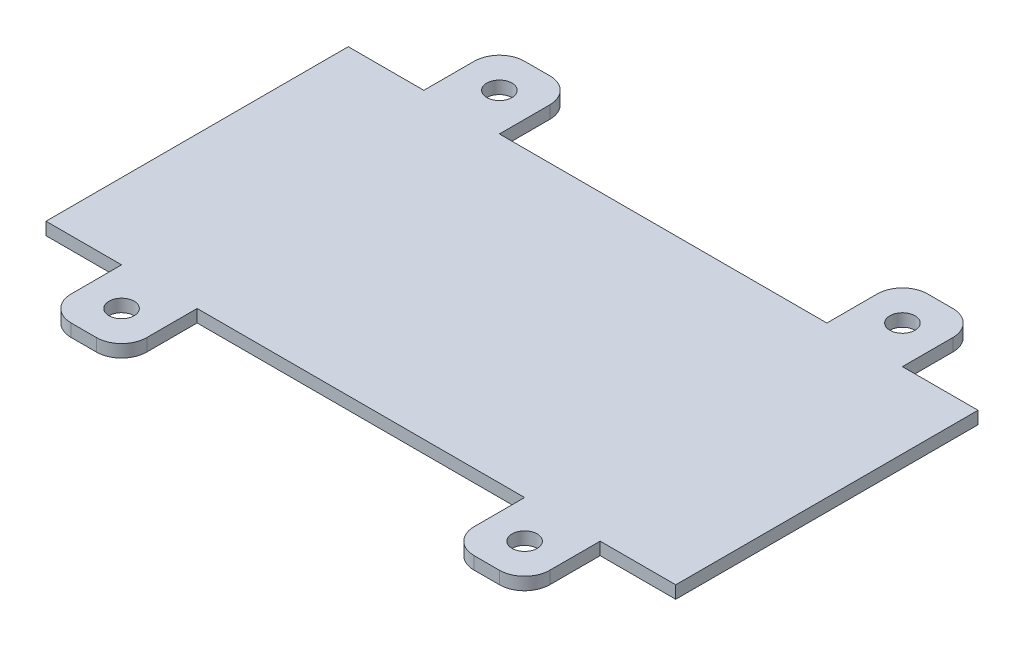
ISO-10303-21;
HEADER;
FILE_DESCRIPTION(('STEP AP214'),'2;1');
FILE_NAME('part.step','',(''),(''),'','','');
FILE_SCHEMA(('AUTOMOTIVE_DESIGN { 1 0 10303 214 1 1 1 1 }'));
ENDSEC;
DATA;
#1=APPLICATION_CONTEXT('core data for automotive mechanical design processes');
#2=APPLICATION_PROTOCOL_DEFINITION('international standard','automotive_design',2000,#1);
#3=PRODUCT_CONTEXT('',#1,'mechanical');
#4=PRODUCT('Part','Part','',(#3));
#5=PRODUCT_RELATED_PRODUCT_CATEGORY('part','',(#4));
#6=PRODUCT_DEFINITION_FORMATION('','',#4);
#7=PRODUCT_DEFINITION_CONTEXT('part definition',#1,'design');
#8=PRODUCT_DEFINITION('design','',#6,#7);
#9=PRODUCT_DEFINITION_SHAPE('','',#8);
#10=(LENGTH_UNIT() NAMED_UNIT(*) SI_UNIT(.MILLI.,.METRE.));
#11=(NAMED_UNIT(*) PLANE_ANGLE_UNIT() SI_UNIT($,.RADIAN.));
#12=(NAMED_UNIT(*) SI_UNIT($,.STERADIAN.) SOLID_ANGLE_UNIT());
#13=UNCERTAINTY_MEASURE_WITH_UNIT(LENGTH_MEASURE(1.E-05),#10,'distance_accuracy_value','');
#14=(GEOMETRIC_REPRESENTATION_CONTEXT(3) GLOBAL_UNCERTAINTY_ASSIGNED_CONTEXT((#13)) GLOBAL_UNIT_ASSIGNED_CONTEXT((#10,
#11,#12)) REPRESENTATION_CONTEXT('',''));
#15=CARTESIAN_POINT('',(0.,0.,0.));
#16=DIRECTION('',(0.,0.,1.));
#17=DIRECTION('',(1.,0.,0.));
#18=AXIS2_PLACEMENT_3D('',#15,#16,#17);
#19=CARTESIAN_POINT('',(-125.,5.,60.));
#20=DIRECTION('',(0.,0.,-1.));
#21=DIRECTION('',(-1.,0.,0.));
#22=AXIS2_PLACEMENT_3D('',#19,#20,#21);
#23=PLANE('',#22);
#24=DIRECTION('',(0.,-1.,0.));
#25=VECTOR('',#24,1.);
#26=CARTESIAN_POINT('',(65.,47.4264068711929,60.));
#27=LINE('',#26,#25);
#28=CARTESIAN_POINT('',(65.,5.,60.));
#29=VERTEX_POINT('',#28);
#30=CARTESIAN_POINT('',(65.,0.,60.));
#31=VERTEX_POINT('',#30);
#32=EDGE_CURVE('E60',#29,#31,#27,.T.);
#33=ORIENTED_EDGE('',*,*,#32,.F.);
#34=DIRECTION('',(1.,0.,0.));
#35=VECTOR('',#34,1.);
#36=CARTESIAN_POINT('',(-125.,5.,60.));
#37=LINE('',#36,#35);
#38=CARTESIAN_POINT('',(-65.,5.,60.));
#39=VERTEX_POINT('',#38);
#40=EDGE_CURVE('E437',#39,#29,#37,.T.);
#41=ORIENTED_EDGE('',*,*,#40,.F.);
#42=DIRECTION('',(0.,-1.,0.));
#43=VECTOR('',#42,1.);
#44=CARTESIAN_POINT('',(-65.,47.4264068711929,60.));
#45=LINE('',#44,#43);
#46=CARTESIAN_POINT('',(-65.,0.,60.));
#47=VERTEX_POINT('',#46);
#48=EDGE_CURVE('E222',#39,#47,#45,.T.);
#49=ORIENTED_EDGE('',*,*,#48,.T.);
#50=DIRECTION('',(1.,0.,0.));
#51=VECTOR('',#50,1.);
#52=CARTESIAN_POINT('',(-125.,0.,60.));
#53=LINE('',#52,#51);
#54=EDGE_CURVE('E220',#47,#31,#53,.T.);
#55=ORIENTED_EDGE('',*,*,#54,.T.);
#56=EDGE_LOOP('',(#33,#41,#49,#55));
#57=FACE_BOUND('',#56,.T.);
#58=ADVANCED_FACE('F37',(#57),#23,.F.);
#59=CARTESIAN_POINT('',(-125.,5.,-60.));
#60=DIRECTION('',(0.,0.,1.));
#61=DIRECTION('',(1.,0.,0.));
#62=AXIS2_PLACEMENT_3D('',#59,#60,#61);
#63=PLANE('',#62);
#64=DIRECTION('',(0.,-1.,0.));
#65=VECTOR('',#64,1.);
#66=CARTESIAN_POINT('',(-65.,47.4264068711929,-60.));
#67=LINE('',#66,#65);
#68=CARTESIAN_POINT('',(-65.,5.,-60.));
#69=VERTEX_POINT('',#68);
#70=CARTESIAN_POINT('',(-65.,0.,-60.));
#71=VERTEX_POINT('',#70);
#72=EDGE_CURVE('E301',#69,#71,#67,.T.);
#73=ORIENTED_EDGE('',*,*,#72,.F.);
#74=DIRECTION('',(-1.,0.,0.));
#75=VECTOR('',#74,1.);
#76=CARTESIAN_POINT('',(-125.,5.,-60.));
#77=LINE('',#76,#75);
#78=CARTESIAN_POINT('',(65.,5.,-60.));
#79=VERTEX_POINT('',#78);
#80=EDGE_CURVE('E431',#79,#69,#77,.T.);
#81=ORIENTED_EDGE('',*,*,#80,.F.);
#82=DIRECTION('',(0.,-1.,0.));
#83=VECTOR('',#82,1.);
#84=CARTESIAN_POINT('',(65.,47.4264068711929,-60.));
#85=LINE('',#84,#83);
#86=CARTESIAN_POINT('',(65.,0.,-60.));
#87=VERTEX_POINT('',#86);
#88=EDGE_CURVE('E348',#79,#87,#85,.T.);
#89=ORIENTED_EDGE('',*,*,#88,.T.);
#90=DIRECTION('',(-1.,0.,0.));
#91=VECTOR('',#90,1.);
#92=CARTESIAN_POINT('',(-125.,0.,-60.));
#93=LINE('',#92,#91);
#94=EDGE_CURVE('E444',#87,#71,#93,.T.);
#95=ORIENTED_EDGE('',*,*,#94,.T.);
#96=EDGE_LOOP('',(#73,#81,#89,#95));
#97=FACE_BOUND('',#96,.T.);
#98=ADVANCED_FACE('F543',(#97),#63,.F.);
#99=DIRECTION('',(0.,-1.,0.));
#100=VECTOR('',#99,1.);
#101=CARTESIAN_POINT('',(95.,47.4264068711929,-60.));
#102=LINE('',#101,#100);
#103=CARTESIAN_POINT('',(95.,5.,-60.));
#104=VERTEX_POINT('',#103);
#105=CARTESIAN_POINT('',(95.,0.,-60.));
#106=VERTEX_POINT('',#105);
#107=EDGE_CURVE('E350',#104,#106,#102,.T.);
#108=ORIENTED_EDGE('',*,*,#107,.F.);
#109=CARTESIAN_POINT('',(125.,5.,-60.));
#110=VERTEX_POINT('',#109);
#111=EDGE_CURVE('E427',#110,#104,#77,.T.);
#112=ORIENTED_EDGE('',*,*,#111,.F.);
#113=DIRECTION('',(0.,-1.,0.));
#114=VECTOR('',#113,1.);
#115=CARTESIAN_POINT('',(125.,5.,-60.));
#116=LINE('',#115,#114);
#117=CARTESIAN_POINT('',(125.,0.,-60.));
#118=VERTEX_POINT('',#117);
#119=EDGE_CURVE('E11',#110,#118,#116,.T.);
#120=ORIENTED_EDGE('',*,*,#119,.T.);
#121=EDGE_CURVE('E441',#118,#106,#93,.T.);
#122=ORIENTED_EDGE('',*,*,#121,.T.);
#123=EDGE_LOOP('',(#108,#112,#120,#122));
#124=FACE_BOUND('',#123,.T.);
#125=ADVANCED_FACE('F495',(#124),#63,.F.);
#126=DIRECTION('',(0.,-1.,0.));
#127=VECTOR('',#126,1.);
#128=CARTESIAN_POINT('',(-95.,47.4264068711929,60.));
#129=LINE('',#128,#127);
#130=CARTESIAN_POINT('',(-95.,5.,60.));
#131=VERTEX_POINT('',#130);
#132=CARTESIAN_POINT('',(-95.,0.,60.));
#133=VERTEX_POINT('',#132);
#134=EDGE_CURVE('E397',#131,#133,#129,.T.);
#135=ORIENTED_EDGE('',*,*,#134,.F.);
#136=CARTESIAN_POINT('',(-125.,5.,60.));
#137=VERTEX_POINT('',#136);
#138=EDGE_CURVE('E433',#137,#131,#37,.T.);
#139=ORIENTED_EDGE('',*,*,#138,.F.);
#140=DIRECTION('',(0.,-1.,0.));
#141=VECTOR('',#140,1.);
#142=CARTESIAN_POINT('',(-125.,5.,60.));
#143=LINE('',#142,#141);
#144=CARTESIAN_POINT('',(-125.,0.,60.));
#145=VERTEX_POINT('',#144);
#146=EDGE_CURVE('E448',#137,#145,#143,.T.);
#147=ORIENTED_EDGE('',*,*,#146,.T.);
#148=EDGE_CURVE('E227',#145,#133,#53,.T.);
#149=ORIENTED_EDGE('',*,*,#148,.T.);
#150=EDGE_LOOP('',(#135,#139,#147,#149));
#151=FACE_BOUND('',#150,.T.);
#152=ADVANCED_FACE('F463',(#151),#23,.F.);
#153=CARTESIAN_POINT('',(125.,5.,-60.));
#154=DIRECTION('',(-1.,0.,0.));
#155=DIRECTION('',(0.,0.,1.));
#156=AXIS2_PLACEMENT_3D('',#153,#154,#155);
#157=PLANE('',#156);
#158=DIRECTION('',(0.,0.,-1.));
#159=VECTOR('',#158,1.);
#160=CARTESIAN_POINT('',(125.,0.,-60.));
#161=LINE('',#160,#159);
#162=CARTESIAN_POINT('',(125.,0.,60.));
#163=VERTEX_POINT('',#162);
#164=EDGE_CURVE('E422',#163,#118,#161,.T.);
#165=ORIENTED_EDGE('',*,*,#164,.T.);
#166=ORIENTED_EDGE('',*,*,#119,.F.);
#167=DIRECTION('',(0.,0.,-1.));
#168=VECTOR('',#167,1.);
#169=CARTESIAN_POINT('',(125.,5.,-60.));
#170=LINE('',#169,#168);
#171=CARTESIAN_POINT('',(125.,5.,60.));
#172=VERTEX_POINT('',#171);
#173=EDGE_CURVE('E423',#172,#110,#170,.T.);
#174=ORIENTED_EDGE('',*,*,#173,.F.);
#175=DIRECTION('',(0.,-1.,0.));
#176=VECTOR('',#175,1.);
#177=CARTESIAN_POINT('',(125.,5.,60.));
#178=LINE('',#177,#176);
#179=EDGE_CURVE('E436',#172,#163,#178,.T.);
#180=ORIENTED_EDGE('',*,*,#179,.T.);
#181=EDGE_LOOP('',(#165,#166,#174,#180));
#182=FACE_BOUND('',#181,.T.);
#183=ADVANCED_FACE('F39',(#182),#157,.F.);
#184=CARTESIAN_POINT('',(-95.,5.,-60.));
#185=VERTEX_POINT('',#184);
#186=CARTESIAN_POINT('',(-125.,5.,-60.));
#187=VERTEX_POINT('',#186);
#188=EDGE_CURVE('E426',#185,#187,#77,.T.);
#189=ORIENTED_EDGE('',*,*,#188,.F.);
#190=DIRECTION('',(0.,-1.,0.));
#191=VECTOR('',#190,1.);
#192=CARTESIAN_POINT('',(-95.,47.4264068711929,-60.));
#193=LINE('',#192,#191);
#194=CARTESIAN_POINT('',(-95.,0.,-60.));
#195=VERTEX_POINT('',#194);
#196=EDGE_CURVE('E304',#185,#195,#193,.T.);
#197=ORIENTED_EDGE('',*,*,#196,.T.);
#198=CARTESIAN_POINT('',(-125.,0.,-60.));
#199=VERTEX_POINT('',#198);
#200=EDGE_CURVE('E440',#195,#199,#93,.T.);
#201=ORIENTED_EDGE('',*,*,#200,.T.);
#202=DIRECTION('',(0.,-1.,0.));
#203=VECTOR('',#202,1.);
#204=CARTESIAN_POINT('',(-125.,5.,-60.));
#205=LINE('',#204,#203);
#206=EDGE_CURVE('E45',#187,#199,#205,.T.);
#207=ORIENTED_EDGE('',*,*,#206,.F.);
#208=EDGE_LOOP('',(#189,#197,#201,#207));
#209=FACE_BOUND('',#208,.T.);
#210=ADVANCED_FACE('F541',(#209),#63,.F.);
#211=CARTESIAN_POINT('',(-125.,5.,-60.));
#212=DIRECTION('',(1.,0.,0.));
#213=DIRECTION('',(0.,0.,-1.));
#214=AXIS2_PLACEMENT_3D('',#211,#212,#213);
#215=PLANE('',#214);
#216=DIRECTION('',(0.,0.,1.));
#217=VECTOR('',#216,1.);
#218=CARTESIAN_POINT('',(-125.,0.,-60.));
#219=LINE('',#218,#217);
#220=EDGE_CURVE('E443',#199,#145,#219,.T.);
#221=ORIENTED_EDGE('',*,*,#220,.T.);
#222=ORIENTED_EDGE('',*,*,#146,.F.);
#223=DIRECTION('',(0.,0.,1.));
#224=VECTOR('',#223,1.);
#225=CARTESIAN_POINT('',(-125.,5.,-60.));
#226=LINE('',#225,#224);
#227=EDGE_CURVE('E430',#187,#137,#226,.T.);
#228=ORIENTED_EDGE('',*,*,#227,.F.);
#229=ORIENTED_EDGE('',*,*,#206,.T.);
#230=EDGE_LOOP('',(#221,#222,#228,#229));
#231=FACE_BOUND('',#230,.T.);
#232=ADVANCED_FACE('F455',(#231),#215,.F.);
#233=CARTESIAN_POINT('',(95.,5.,60.));
#234=VERTEX_POINT('',#233);
#235=EDGE_CURVE('E52',#234,#172,#37,.T.);
#236=ORIENTED_EDGE('',*,*,#235,.F.);
#237=DIRECTION('',(0.,-1.,0.));
#238=VECTOR('',#237,1.);
#239=CARTESIAN_POINT('',(95.,47.4264068711929,60.));
#240=LINE('',#239,#238);
#241=CARTESIAN_POINT('',(95.,0.,60.));
#242=VERTEX_POINT('',#241);
#243=EDGE_CURVE('E238',#234,#242,#240,.T.);
#244=ORIENTED_EDGE('',*,*,#243,.T.);
#245=EDGE_CURVE('E228',#242,#163,#53,.T.);
#246=ORIENTED_EDGE('',*,*,#245,.T.);
#247=ORIENTED_EDGE('',*,*,#179,.F.);
#248=EDGE_LOOP('',(#236,#244,#246,#247));
#249=FACE_BOUND('',#248,.T.);
#250=ADVANCED_FACE('F491',(#249),#23,.F.);
#251=CARTESIAN_POINT('',(0.,5.,0.));
#252=DIRECTION('',(0.,1.,0.));
#253=DIRECTION('',(0.,0.,1.));
#254=AXIS2_PLACEMENT_3D('',#251,#252,#253);
#255=PLANE('',#254);
#256=ORIENTED_EDGE('',*,*,#173,.T.);
#257=ORIENTED_EDGE('',*,*,#111,.T.);
#258=DIRECTION('',(0.,0.,1.));
#259=VECTOR('',#258,1.);
#260=CARTESIAN_POINT('',(95.,5.,-60.));
#261=LINE('',#260,#259);
#262=CARTESIAN_POINT('',(95.,5.,-80.));
#263=VERTEX_POINT('',#262);
#264=EDGE_CURVE('E333',#263,#104,#261,.T.);
#265=ORIENTED_EDGE('',*,*,#264,.F.);
#266=CARTESIAN_POINT('',(85.,5.,-80.));
#267=DIRECTION('',(0.,-1.,0.));
#268=DIRECTION('',(0.,0.,1.));
#269=AXIS2_PLACEMENT_3D('',#266,#267,#268);
#270=CIRCLE('',#269,10.);
#271=CARTESIAN_POINT('',(85.,5.,-90.));
#272=VERTEX_POINT('',#271);
#273=EDGE_CURVE('E370',#272,#263,#270,.T.);
#274=ORIENTED_EDGE('',*,*,#273,.F.);
#275=DIRECTION('',(1.,0.,0.));
#276=VECTOR('',#275,1.);
#277=CARTESIAN_POINT('',(95.,5.,-90.));
#278=LINE('',#277,#276);
#279=CARTESIAN_POINT('',(75.,5.,-90.));
#280=VERTEX_POINT('',#279);
#281=EDGE_CURVE('E327',#280,#272,#278,.T.);
#282=ORIENTED_EDGE('',*,*,#281,.F.);
#283=CARTESIAN_POINT('',(75.,5.,-80.));
#284=DIRECTION('',(0.,-1.,0.));
#285=DIRECTION('',(0.,0.,1.));
#286=AXIS2_PLACEMENT_3D('',#283,#284,#285);
#287=CIRCLE('',#286,10.);
#288=CARTESIAN_POINT('',(65.,5.,-80.));
#289=VERTEX_POINT('',#288);
#290=EDGE_CURVE('E368',#289,#280,#287,.T.);
#291=ORIENTED_EDGE('',*,*,#290,.F.);
#292=DIRECTION('',(0.,0.,-1.));
#293=VECTOR('',#292,1.);
#294=CARTESIAN_POINT('',(65.,5.,-60.));
#295=LINE('',#294,#293);
#296=EDGE_CURVE('E330',#79,#289,#295,.T.);
#297=ORIENTED_EDGE('',*,*,#296,.F.);
#298=ORIENTED_EDGE('',*,*,#80,.T.);
#299=DIRECTION('',(0.,0.,-1.));
#300=VECTOR('',#299,1.);
#301=CARTESIAN_POINT('',(-65.,5.,-60.));
#302=LINE('',#301,#300);
#303=CARTESIAN_POINT('',(-65.,5.,-80.));
#304=VERTEX_POINT('',#303);
#305=EDGE_CURVE('E283',#69,#304,#302,.T.);
#306=ORIENTED_EDGE('',*,*,#305,.T.);
#307=CARTESIAN_POINT('',(-75.,5.,-80.));
#308=DIRECTION('',(0.,1.,0.));
#309=DIRECTION('',(0.,0.,1.));
#310=AXIS2_PLACEMENT_3D('',#307,#308,#309);
#311=CIRCLE('',#310,10.);
#312=CARTESIAN_POINT('',(-75.,5.,-90.));
#313=VERTEX_POINT('',#312);
#314=EDGE_CURVE('E320',#304,#313,#311,.T.);
#315=ORIENTED_EDGE('',*,*,#314,.T.);
#316=DIRECTION('',(-1.,0.,0.));
#317=VECTOR('',#316,1.);
#318=CARTESIAN_POINT('',(-95.,5.,-90.));
#319=LINE('',#318,#317);
#320=CARTESIAN_POINT('',(-85.,5.,-90.));
#321=VERTEX_POINT('',#320);
#322=EDGE_CURVE('E280',#313,#321,#319,.T.);
#323=ORIENTED_EDGE('',*,*,#322,.T.);
#324=CARTESIAN_POINT('',(-85.,5.,-80.));
#325=DIRECTION('',(0.,1.,0.));
#326=DIRECTION('',(0.,0.,1.));
#327=AXIS2_PLACEMENT_3D('',#324,#325,#326);
#328=CIRCLE('',#327,10.);
#329=CARTESIAN_POINT('',(-95.,5.,-80.));
#330=VERTEX_POINT('',#329);
#331=EDGE_CURVE('E322',#321,#330,#328,.T.);
#332=ORIENTED_EDGE('',*,*,#331,.T.);
#333=DIRECTION('',(0.,0.,1.));
#334=VECTOR('',#333,1.);
#335=CARTESIAN_POINT('',(-95.,5.,-60.));
#336=LINE('',#335,#334);
#337=EDGE_CURVE('E286',#330,#185,#336,.T.);
#338=ORIENTED_EDGE('',*,*,#337,.T.);
#339=ORIENTED_EDGE('',*,*,#188,.T.);
#340=ORIENTED_EDGE('',*,*,#227,.T.);
#341=ORIENTED_EDGE('',*,*,#138,.T.);
#342=DIRECTION('',(0.,0.,-1.));
#343=VECTOR('',#342,1.);
#344=CARTESIAN_POINT('',(-95.,5.,60.));
#345=LINE('',#344,#343);
#346=CARTESIAN_POINT('',(-95.,5.,80.));
#347=VERTEX_POINT('',#346);
#348=EDGE_CURVE('E382',#347,#131,#345,.T.);
#349=ORIENTED_EDGE('',*,*,#348,.F.);
#350=CARTESIAN_POINT('',(-85.,5.,80.));
#351=DIRECTION('',(0.,-1.,0.));
#352=DIRECTION('',(0.,0.,-1.));
#353=AXIS2_PLACEMENT_3D('',#350,#351,#352);
#354=CIRCLE('',#353,10.);
#355=CARTESIAN_POINT('',(-85.,5.,90.));
#356=VERTEX_POINT('',#355);
#357=EDGE_CURVE('E417',#356,#347,#354,.T.);
#358=ORIENTED_EDGE('',*,*,#357,.F.);
#359=DIRECTION('',(-1.,0.,0.));
#360=VECTOR('',#359,1.);
#361=CARTESIAN_POINT('',(-95.,5.,90.));
#362=LINE('',#361,#360);
#363=CARTESIAN_POINT('',(-75.,5.,90.));
#364=VERTEX_POINT('',#363);
#365=EDGE_CURVE('E376',#364,#356,#362,.T.);
#366=ORIENTED_EDGE('',*,*,#365,.F.);
#367=CARTESIAN_POINT('',(-75.,5.,80.));
#368=DIRECTION('',(0.,-1.,0.));
#369=DIRECTION('',(0.,0.,-1.));
#370=AXIS2_PLACEMENT_3D('',#367,#368,#369);
#371=CIRCLE('',#370,10.);
#372=CARTESIAN_POINT('',(-65.,5.,80.));
#373=VERTEX_POINT('',#372);
#374=EDGE_CURVE('E415',#373,#364,#371,.T.);
#375=ORIENTED_EDGE('',*,*,#374,.F.);
#376=DIRECTION('',(0.,0.,1.));
#377=VECTOR('',#376,1.);
#378=CARTESIAN_POINT('',(-65.,5.,60.));
#379=LINE('',#378,#377);
#380=EDGE_CURVE('E379',#39,#373,#379,.T.);
#381=ORIENTED_EDGE('',*,*,#380,.F.);
#382=ORIENTED_EDGE('',*,*,#40,.T.);
#383=DIRECTION('',(0.,0.,1.));
#384=VECTOR('',#383,1.);
#385=CARTESIAN_POINT('',(65.,5.,60.));
#386=LINE('',#385,#384);
#387=CARTESIAN_POINT('',(65.,5.,80.));
#388=VERTEX_POINT('',#387);
#389=EDGE_CURVE('E237',#29,#388,#386,.T.);
#390=ORIENTED_EDGE('',*,*,#389,.T.);
#391=CARTESIAN_POINT('',(75.,5.,80.));
#392=DIRECTION('',(0.,1.,0.));
#393=DIRECTION('',(0.,0.,-1.));
#394=AXIS2_PLACEMENT_3D('',#391,#392,#393);
#395=CIRCLE('',#394,10.);
#396=CARTESIAN_POINT('',(75.,5.,90.));
#397=VERTEX_POINT('',#396);
#398=EDGE_CURVE('E273',#388,#397,#395,.T.);
#399=ORIENTED_EDGE('',*,*,#398,.T.);
#400=DIRECTION('',(1.,0.,0.));
#401=VECTOR('',#400,1.);
#402=CARTESIAN_POINT('',(95.,5.,90.));
#403=LINE('',#402,#401);
#404=CARTESIAN_POINT('',(85.,5.,90.));
#405=VERTEX_POINT('',#404);
#406=EDGE_CURVE('E261',#397,#405,#403,.T.);
#407=ORIENTED_EDGE('',*,*,#406,.T.);
#408=CARTESIAN_POINT('',(85.,5.,80.));
#409=DIRECTION('',(0.,1.,0.));
#410=DIRECTION('',(0.,0.,-1.));
#411=AXIS2_PLACEMENT_3D('',#408,#409,#410);
#412=CIRCLE('',#411,10.);
#413=CARTESIAN_POINT('',(95.,5.,80.));
#414=VERTEX_POINT('',#413);
#415=EDGE_CURVE('E275',#405,#414,#412,.T.);
#416=ORIENTED_EDGE('',*,*,#415,.T.);
#417=DIRECTION('',(0.,0.,-1.));
#418=VECTOR('',#417,1.);
#419=CARTESIAN_POINT('',(95.,5.,60.));
#420=LINE('',#419,#418);
#421=EDGE_CURVE('E489',#414,#234,#420,.T.);
#422=ORIENTED_EDGE('',*,*,#421,.T.);
#423=ORIENTED_EDGE('',*,*,#235,.T.);
#424=EDGE_LOOP('',(#256,#257,#265,#274,#282,#291,#297,#298,#306,#315,#323,#332,#338,#339,#340,
#341,#349,#358,#366,#375,#381,#382,#390,#399,#407,#416,#422,#423));
#425=FACE_BOUND('',#424,.T.);
#426=CARTESIAN_POINT('',(-80.,5.,75.));
#427=DIRECTION('',(0.,-1.,0.));
#428=DIRECTION('',(0.,0.,-1.));
#429=AXIS2_PLACEMENT_3D('',#426,#427,#428);
#430=CIRCLE('',#429,5.00000000000001);
#431=CARTESIAN_POINT('',(-80.,5.,70.));
#432=VERTEX_POINT('',#431);
#433=EDGE_CURVE('E375',#432,#432,#430,.T.);
#434=ORIENTED_EDGE('',*,*,#433,.T.);
#435=EDGE_LOOP('',(#434));
#436=FACE_BOUND('',#435,.T.);
#437=CARTESIAN_POINT('',(80.,5.,-75.));
#438=DIRECTION('',(0.,-1.,0.));
#439=DIRECTION('',(0.,0.,1.));
#440=AXIS2_PLACEMENT_3D('',#437,#438,#439);
#441=CIRCLE('',#440,5.00000000000001);
#442=CARTESIAN_POINT('',(80.,5.,-70.));
#443=VERTEX_POINT('',#442);
#444=EDGE_CURVE('E326',#443,#443,#441,.T.);
#445=ORIENTED_EDGE('',*,*,#444,.T.);
#446=EDGE_LOOP('',(#445));
#447=FACE_BOUND('',#446,.T.);
#448=CARTESIAN_POINT('',(-80.,5.,-75.));
#449=DIRECTION('',(0.,1.,0.));
#450=DIRECTION('',(0.,0.,1.));
#451=AXIS2_PLACEMENT_3D('',#448,#449,#450);
#452=CIRCLE('',#451,5.00000000000001);
#453=CARTESIAN_POINT('',(-80.,5.,-70.));
#454=VERTEX_POINT('',#453);
#455=EDGE_CURVE('E279',#454,#454,#452,.T.);
#456=ORIENTED_EDGE('',*,*,#455,.F.);
#457=EDGE_LOOP('',(#456));
#458=FACE_BOUND('',#457,.T.);
#459=CARTESIAN_POINT('',(80.,5.,75.));
#460=DIRECTION('',(0.,1.,0.));
#461=DIRECTION('',(0.,0.,-1.));
#462=AXIS2_PLACEMENT_3D('',#459,#460,#461);
#463=CIRCLE('',#462,5.00000000000001);
#464=CARTESIAN_POINT('',(80.,5.,70.));
#465=VERTEX_POINT('',#464);
#466=EDGE_CURVE('E258',#465,#465,#463,.T.);
#467=ORIENTED_EDGE('',*,*,#466,.F.);
#468=EDGE_LOOP('',(#467));
#469=FACE_BOUND('',#468,.T.);
#470=ADVANCED_FACE('F467',(#425,#436,#447,#458,#469),#255,.T.);
#471=CARTESIAN_POINT('',(0.,0.,0.));
#472=DIRECTION('',(0.,1.,0.));
#473=DIRECTION('',(0.,0.,1.));
#474=AXIS2_PLACEMENT_3D('',#471,#472,#473);
#475=PLANE('',#474);
#476=ORIENTED_EDGE('',*,*,#164,.F.);
#477=ORIENTED_EDGE('',*,*,#245,.F.);
#478=DIRECTION('',(0.,0.,-1.));
#479=VECTOR('',#478,1.);
#480=CARTESIAN_POINT('',(95.,0.,60.));
#481=LINE('',#480,#479);
#482=CARTESIAN_POINT('',(95.,0.,80.));
#483=VERTEX_POINT('',#482);
#484=EDGE_CURVE('E247',#483,#242,#481,.T.);
#485=ORIENTED_EDGE('',*,*,#484,.F.);
#486=CARTESIAN_POINT('',(85.,0.,80.));
#487=DIRECTION('',(0.,-1.,0.));
#488=DIRECTION('',(0.,0.,1.));
#489=AXIS2_PLACEMENT_3D('',#486,#487,#488);
#490=CIRCLE('',#489,10.);
#491=CARTESIAN_POINT('',(85.,0.,90.));
#492=VERTEX_POINT('',#491);
#493=EDGE_CURVE('E265',#483,#492,#490,.T.);
#494=ORIENTED_EDGE('',*,*,#493,.T.);
#495=DIRECTION('',(1.,0.,0.));
#496=VECTOR('',#495,1.);
#497=CARTESIAN_POINT('',(95.,0.,90.));
#498=LINE('',#497,#496);
#499=CARTESIAN_POINT('',(75.,0.,90.));
#500=VERTEX_POINT('',#499);
#501=EDGE_CURVE('E239',#500,#492,#498,.T.);
#502=ORIENTED_EDGE('',*,*,#501,.F.);
#503=CARTESIAN_POINT('',(75.,0.,80.));
#504=DIRECTION('',(0.,-1.,0.));
#505=DIRECTION('',(0.,0.,1.));
#506=AXIS2_PLACEMENT_3D('',#503,#504,#505);
#507=CIRCLE('',#506,10.);
#508=CARTESIAN_POINT('',(65.,0.,80.));
#509=VERTEX_POINT('',#508);
#510=EDGE_CURVE('E245',#500,#509,#507,.T.);
#511=ORIENTED_EDGE('',*,*,#510,.T.);
#512=DIRECTION('',(0.,0.,1.));
#513=VECTOR('',#512,1.);
#514=CARTESIAN_POINT('',(65.,0.,60.));
#515=LINE('',#514,#513);
#516=EDGE_CURVE('E235',#31,#509,#515,.T.);
#517=ORIENTED_EDGE('',*,*,#516,.F.);
#518=ORIENTED_EDGE('',*,*,#54,.F.);
#519=DIRECTION('',(0.,0.,1.));
#520=VECTOR('',#519,1.);
#521=CARTESIAN_POINT('',(-65.,0.,60.));
#522=LINE('',#521,#520);
#523=CARTESIAN_POINT('',(-65.,0.,80.));
#524=VERTEX_POINT('',#523);
#525=EDGE_CURVE('E391',#47,#524,#522,.T.);
#526=ORIENTED_EDGE('',*,*,#525,.T.);
#527=CARTESIAN_POINT('',(-75.,0.,80.));
#528=DIRECTION('',(0.,1.,0.));
#529=DIRECTION('',(0.,0.,1.));
#530=AXIS2_PLACEMENT_3D('',#527,#528,#529);
#531=CIRCLE('',#530,10.);
#532=CARTESIAN_POINT('',(-75.,0.,90.));
#533=VERTEX_POINT('',#532);
#534=EDGE_CURVE('E405',#533,#524,#531,.T.);
#535=ORIENTED_EDGE('',*,*,#534,.F.);
#536=DIRECTION('',(-1.,0.,0.));
#537=VECTOR('',#536,1.);
#538=CARTESIAN_POINT('',(-95.,0.,90.));
#539=LINE('',#538,#537);
#540=CARTESIAN_POINT('',(-85.,0.,90.));
#541=VERTEX_POINT('',#540);
#542=EDGE_CURVE('E393',#533,#541,#539,.T.);
#543=ORIENTED_EDGE('',*,*,#542,.T.);
#544=CARTESIAN_POINT('',(-85.,0.,80.));
#545=DIRECTION('',(0.,1.,0.));
#546=DIRECTION('',(0.,0.,1.));
#547=AXIS2_PLACEMENT_3D('',#544,#545,#546);
#548=CIRCLE('',#547,10.);
#549=CARTESIAN_POINT('',(-95.,0.,80.));
#550=VERTEX_POINT('',#549);
#551=EDGE_CURVE('E407',#550,#541,#548,.T.);
#552=ORIENTED_EDGE('',*,*,#551,.F.);
#553=DIRECTION('',(0.,0.,-1.));
#554=VECTOR('',#553,1.);
#555=CARTESIAN_POINT('',(-95.,0.,60.));
#556=LINE('',#555,#554);
#557=EDGE_CURVE('E388',#550,#133,#556,.T.);
#558=ORIENTED_EDGE('',*,*,#557,.T.);
#559=ORIENTED_EDGE('',*,*,#148,.F.);
#560=ORIENTED_EDGE('',*,*,#220,.F.);
#561=ORIENTED_EDGE('',*,*,#200,.F.);
#562=DIRECTION('',(0.,0.,1.));
#563=VECTOR('',#562,1.);
#564=CARTESIAN_POINT('',(-95.,0.,-60.));
#565=LINE('',#564,#563);
#566=CARTESIAN_POINT('',(-95.,0.,-80.));
#567=VERTEX_POINT('',#566);
#568=EDGE_CURVE('E292',#567,#195,#565,.T.);
#569=ORIENTED_EDGE('',*,*,#568,.F.);
#570=CARTESIAN_POINT('',(-85.,0.,-80.));
#571=DIRECTION('',(0.,-1.,0.));
#572=DIRECTION('',(0.,0.,-1.));
#573=AXIS2_PLACEMENT_3D('',#570,#571,#572);
#574=CIRCLE('',#573,10.);
#575=CARTESIAN_POINT('',(-85.,0.,-90.));
#576=VERTEX_POINT('',#575);
#577=EDGE_CURVE('E313',#567,#576,#574,.T.);
#578=ORIENTED_EDGE('',*,*,#577,.T.);
#579=DIRECTION('',(-1.,0.,0.));
#580=VECTOR('',#579,1.);
#581=CARTESIAN_POINT('',(-95.,0.,-90.));
#582=LINE('',#581,#580);
#583=CARTESIAN_POINT('',(-75.,0.,-90.));
#584=VERTEX_POINT('',#583);
#585=EDGE_CURVE('E298',#584,#576,#582,.T.);
#586=ORIENTED_EDGE('',*,*,#585,.F.);
#587=CARTESIAN_POINT('',(-75.,0.,-80.));
#588=DIRECTION('',(0.,-1.,0.));
#589=DIRECTION('',(0.,0.,-1.));
#590=AXIS2_PLACEMENT_3D('',#587,#588,#589);
#591=CIRCLE('',#590,10.);
#592=CARTESIAN_POINT('',(-65.,0.,-80.));
#593=VERTEX_POINT('',#592);
#594=EDGE_CURVE('E311',#584,#593,#591,.T.);
#595=ORIENTED_EDGE('',*,*,#594,.T.);
#596=DIRECTION('',(0.,0.,-1.));
#597=VECTOR('',#596,1.);
#598=CARTESIAN_POINT('',(-65.,0.,-60.));
#599=LINE('',#598,#597);
#600=EDGE_CURVE('E295',#71,#593,#599,.T.);
#601=ORIENTED_EDGE('',*,*,#600,.F.);
#602=ORIENTED_EDGE('',*,*,#94,.F.);
#603=DIRECTION('',(0.,0.,-1.));
#604=VECTOR('',#603,1.);
#605=CARTESIAN_POINT('',(65.,0.,-60.));
#606=LINE('',#605,#604);
#607=CARTESIAN_POINT('',(65.,0.,-80.));
#608=VERTEX_POINT('',#607);
#609=EDGE_CURVE('E342',#87,#608,#606,.T.);
#610=ORIENTED_EDGE('',*,*,#609,.T.);
#611=CARTESIAN_POINT('',(75.,0.,-80.));
#612=DIRECTION('',(0.,1.,0.));
#613=DIRECTION('',(0.,0.,-1.));
#614=AXIS2_PLACEMENT_3D('',#611,#612,#613);
#615=CIRCLE('',#614,10.);
#616=CARTESIAN_POINT('',(75.,0.,-90.));
#617=VERTEX_POINT('',#616);
#618=EDGE_CURVE('E358',#617,#608,#615,.T.);
#619=ORIENTED_EDGE('',*,*,#618,.F.);
#620=DIRECTION('',(1.,0.,0.));
#621=VECTOR('',#620,1.);
#622=CARTESIAN_POINT('',(95.,0.,-90.));
#623=LINE('',#622,#621);
#624=CARTESIAN_POINT('',(85.,0.,-90.));
#625=VERTEX_POINT('',#624);
#626=EDGE_CURVE('E345',#617,#625,#623,.T.);
#627=ORIENTED_EDGE('',*,*,#626,.T.);
#628=CARTESIAN_POINT('',(85.,0.,-80.));
#629=DIRECTION('',(0.,1.,0.));
#630=DIRECTION('',(0.,0.,-1.));
#631=AXIS2_PLACEMENT_3D('',#628,#629,#630);
#632=CIRCLE('',#631,10.);
#633=CARTESIAN_POINT('',(95.,0.,-80.));
#634=VERTEX_POINT('',#633);
#635=EDGE_CURVE('E360',#634,#625,#632,.T.);
#636=ORIENTED_EDGE('',*,*,#635,.F.);
#637=DIRECTION('',(0.,0.,1.));
#638=VECTOR('',#637,1.);
#639=CARTESIAN_POINT('',(95.,0.,-60.));
#640=LINE('',#639,#638);
#641=EDGE_CURVE('E339',#634,#106,#640,.T.);
#642=ORIENTED_EDGE('',*,*,#641,.T.);
#643=ORIENTED_EDGE('',*,*,#121,.F.);
#644=EDGE_LOOP('',(#476,#477,#485,#494,#502,#511,#517,#518,#526,#535,#543,#552,#558,#559,#560,
#561,#569,#578,#586,#595,#601,#602,#610,#619,#627,#636,#642,#643));
#645=FACE_BOUND('',#644,.T.);
#646=CARTESIAN_POINT('',(-80.,0.,75.));
#647=DIRECTION('',(0.,-1.,0.));
#648=DIRECTION('',(0.,0.,-1.));
#649=AXIS2_PLACEMENT_3D('',#646,#647,#648);
#650=CIRCLE('',#649,5.00000000000001);
#651=CARTESIAN_POINT('',(-80.,0.,70.));
#652=VERTEX_POINT('',#651);
#653=EDGE_CURVE('E385',#652,#652,#650,.T.);
#654=ORIENTED_EDGE('',*,*,#653,.F.);
#655=EDGE_LOOP('',(#654));
#656=FACE_BOUND('',#655,.T.);
#657=CARTESIAN_POINT('',(80.,0.,-75.));
#658=DIRECTION('',(0.,-1.,0.));
#659=DIRECTION('',(0.,0.,1.));
#660=AXIS2_PLACEMENT_3D('',#657,#658,#659);
#661=CIRCLE('',#660,5.00000000000001);
#662=CARTESIAN_POINT('',(80.,0.,-70.));
#663=VERTEX_POINT('',#662);
#664=EDGE_CURVE('E336',#663,#663,#661,.T.);
#665=ORIENTED_EDGE('',*,*,#664,.F.);
#666=EDGE_LOOP('',(#665));
#667=FACE_BOUND('',#666,.T.);
#668=CARTESIAN_POINT('',(-80.,0.,-75.));
#669=DIRECTION('',(0.,1.,0.));
#670=DIRECTION('',(0.,0.,1.));
#671=AXIS2_PLACEMENT_3D('',#668,#669,#670);
#672=CIRCLE('',#671,5.00000000000001);
#673=CARTESIAN_POINT('',(-80.,0.,-70.));
#674=VERTEX_POINT('',#673);
#675=EDGE_CURVE('E289',#674,#674,#672,.T.);
#676=ORIENTED_EDGE('',*,*,#675,.T.);
#677=EDGE_LOOP('',(#676));
#678=FACE_BOUND('',#677,.T.);
#679=CARTESIAN_POINT('',(80.,0.,75.));
#680=DIRECTION('',(0.,1.,0.));
#681=DIRECTION('',(0.,0.,-1.));
#682=AXIS2_PLACEMENT_3D('',#679,#680,#681);
#683=CIRCLE('',#682,5.00000000000001);
#684=CARTESIAN_POINT('',(80.,0.,70.));
#685=VERTEX_POINT('',#684);
#686=EDGE_CURVE('E252',#685,#685,#683,.T.);
#687=ORIENTED_EDGE('',*,*,#686,.T.);
#688=EDGE_LOOP('',(#687));
#689=FACE_BOUND('',#688,.T.);
#690=ADVANCED_FACE('F242',(#645,#656,#667,#678,#689),#475,.F.);
#691=CARTESIAN_POINT('',(-95.,47.4264068711929,90.));
#692=DIRECTION('',(0.,0.,-1.));
#693=DIRECTION('',(1.,0.,0.));
#694=AXIS2_PLACEMENT_3D('',#691,#692,#693);
#695=PLANE('',#694);
#696=ORIENTED_EDGE('',*,*,#542,.F.);
#697=DIRECTION('',(0.,-1.,0.));
#698=VECTOR('',#697,1.);
#699=CARTESIAN_POINT('',(-75.,47.4264068711929,90.));
#700=LINE('',#699,#698);
#701=EDGE_CURVE('E409',#364,#533,#700,.T.);
#702=ORIENTED_EDGE('',*,*,#701,.F.);
#703=ORIENTED_EDGE('',*,*,#365,.T.);
#704=DIRECTION('',(0.,-1.,0.));
#705=VECTOR('',#704,1.);
#706=CARTESIAN_POINT('',(-85.,47.4264068711929,90.));
#707=LINE('',#706,#705);
#708=EDGE_CURVE('E412',#541,#356,#707,.F.);
#709=ORIENTED_EDGE('',*,*,#708,.F.);
#710=EDGE_LOOP('',(#696,#702,#703,#709));
#711=FACE_BOUND('',#710,.T.);
#712=ADVANCED_FACE('F480',(#711),#695,.F.);
#713=CARTESIAN_POINT('',(-65.,47.4264068711929,60.));
#714=DIRECTION('',(-1.,0.,0.));
#715=DIRECTION('',(0.,0.,-1.));
#716=AXIS2_PLACEMENT_3D('',#713,#714,#715);
#717=PLANE('',#716);
#718=ORIENTED_EDGE('',*,*,#525,.F.);
#719=ORIENTED_EDGE('',*,*,#48,.F.);
#720=ORIENTED_EDGE('',*,*,#380,.T.);
#721=DIRECTION('',(0.,-1.,0.));
#722=VECTOR('',#721,1.);
#723=CARTESIAN_POINT('',(-65.,47.4264068711929,80.));
#724=LINE('',#723,#722);
#725=EDGE_CURVE('E419',#524,#373,#724,.F.);
#726=ORIENTED_EDGE('',*,*,#725,.F.);
#727=EDGE_LOOP('',(#718,#719,#720,#726));
#728=FACE_BOUND('',#727,.T.);
#729=ADVANCED_FACE('F485',(#728),#717,.F.);
#730=CARTESIAN_POINT('',(-95.,47.4264068711929,60.));
#731=DIRECTION('',(1.,0.,0.));
#732=DIRECTION('',(0.,0.,1.));
#733=AXIS2_PLACEMENT_3D('',#730,#731,#732);
#734=PLANE('',#733);
#735=ORIENTED_EDGE('',*,*,#348,.T.);
#736=ORIENTED_EDGE('',*,*,#134,.T.);
#737=ORIENTED_EDGE('',*,*,#557,.F.);
#738=DIRECTION('',(0.,-1.,0.));
#739=VECTOR('',#738,1.);
#740=CARTESIAN_POINT('',(-95.,47.4264068711929,80.));
#741=LINE('',#740,#739);
#742=EDGE_CURVE('E400',#347,#550,#741,.T.);
#743=ORIENTED_EDGE('',*,*,#742,.F.);
#744=EDGE_LOOP('',(#735,#736,#737,#743));
#745=FACE_BOUND('',#744,.T.);
#746=ADVANCED_FACE('F471',(#745),#734,.F.);
#747=CARTESIAN_POINT('',(-80.,47.4264068711929,75.));
#748=DIRECTION('',(0.,-1.,0.));
#749=DIRECTION('',(0.,0.,1.));
#750=AXIS2_PLACEMENT_3D('',#747,#748,#749);
#751=CYLINDRICAL_SURFACE('',#750,5.00000000000001);
#752=ORIENTED_EDGE('',*,*,#653,.T.);
#753=EDGE_LOOP('',(#752));
#754=FACE_BOUND('',#753,.T.);
#755=ORIENTED_EDGE('',*,*,#433,.F.);
#756=EDGE_LOOP('',(#755));
#757=FACE_BOUND('',#756,.T.);
#758=ADVANCED_FACE('F634',(#754,#757),#751,.F.);
#759=CARTESIAN_POINT('',(-85.,47.4264068711929,80.));
#760=DIRECTION('',(0.,-1.,0.));
#761=DIRECTION('',(0.,0.,1.));
#762=AXIS2_PLACEMENT_3D('',#759,#760,#761);
#763=CYLINDRICAL_SURFACE('',#762,10.);
#764=ORIENTED_EDGE('',*,*,#357,.T.);
#765=ORIENTED_EDGE('',*,*,#742,.T.);
#766=ORIENTED_EDGE('',*,*,#551,.T.);
#767=ORIENTED_EDGE('',*,*,#708,.T.);
#768=EDGE_LOOP('',(#764,#765,#766,#767));
#769=FACE_BOUND('',#768,.T.);
#770=ADVANCED_FACE('F473',(#769),#763,.T.);
#771=CARTESIAN_POINT('',(-75.,47.4264068711929,80.));
#772=DIRECTION('',(0.,-1.,0.));
#773=DIRECTION('',(0.,0.,1.));
#774=AXIS2_PLACEMENT_3D('',#771,#772,#773);
#775=CYLINDRICAL_SURFACE('',#774,10.);
#776=ORIENTED_EDGE('',*,*,#374,.T.);
#777=ORIENTED_EDGE('',*,*,#701,.T.);
#778=ORIENTED_EDGE('',*,*,#534,.T.);
#779=ORIENTED_EDGE('',*,*,#725,.T.);
#780=EDGE_LOOP('',(#776,#777,#778,#779));
#781=FACE_BOUND('',#780,.T.);
#782=ADVANCED_FACE('F482',(#781),#775,.T.);
#783=CARTESIAN_POINT('',(95.,47.4264068711929,-90.));
#784=DIRECTION('',(0.,0.,1.));
#785=DIRECTION('',(-1.,0.,0.));
#786=AXIS2_PLACEMENT_3D('',#783,#784,#785);
#787=PLANE('',#786);
#788=ORIENTED_EDGE('',*,*,#626,.F.);
#789=DIRECTION('',(0.,-1.,0.));
#790=VECTOR('',#789,1.);
#791=CARTESIAN_POINT('',(75.,47.4264068711929,-90.));
#792=LINE('',#791,#790);
#793=EDGE_CURVE('E362',#280,#617,#792,.T.);
#794=ORIENTED_EDGE('',*,*,#793,.F.);
#795=ORIENTED_EDGE('',*,*,#281,.T.);
#796=DIRECTION('',(0.,-1.,0.));
#797=VECTOR('',#796,1.);
#798=CARTESIAN_POINT('',(85.,47.4264068711929,-90.));
#799=LINE('',#798,#797);
#800=EDGE_CURVE('E365',#625,#272,#799,.F.);
#801=ORIENTED_EDGE('',*,*,#800,.F.);
#802=EDGE_LOOP('',(#788,#794,#795,#801));
#803=FACE_BOUND('',#802,.T.);
#804=ADVANCED_FACE('F509',(#803),#787,.F.);
#805=CARTESIAN_POINT('',(65.,47.4264068711929,-60.));
#806=DIRECTION('',(1.,0.,0.));
#807=DIRECTION('',(0.,0.,1.));
#808=AXIS2_PLACEMENT_3D('',#805,#806,#807);
#809=PLANE('',#808);
#810=ORIENTED_EDGE('',*,*,#609,.F.);
#811=ORIENTED_EDGE('',*,*,#88,.F.);
#812=ORIENTED_EDGE('',*,*,#296,.T.);
#813=DIRECTION('',(0.,-1.,0.));
#814=VECTOR('',#813,1.);
#815=CARTESIAN_POINT('',(65.,47.4264068711929,-80.));
#816=LINE('',#815,#814);
#817=EDGE_CURVE('E372',#608,#289,#816,.F.);
#818=ORIENTED_EDGE('',*,*,#817,.F.);
#819=EDGE_LOOP('',(#810,#811,#812,#818));
#820=FACE_BOUND('',#819,.T.);
#821=ADVANCED_FACE('F516',(#820),#809,.F.);
#822=CARTESIAN_POINT('',(95.,47.4264068711929,-60.));
#823=DIRECTION('',(-1.,0.,0.));
#824=DIRECTION('',(0.,0.,-1.));
#825=AXIS2_PLACEMENT_3D('',#822,#823,#824);
#826=PLANE('',#825);
#827=ORIENTED_EDGE('',*,*,#264,.T.);
#828=ORIENTED_EDGE('',*,*,#107,.T.);
#829=ORIENTED_EDGE('',*,*,#641,.F.);
#830=DIRECTION('',(0.,-1.,0.));
#831=VECTOR('',#830,1.);
#832=CARTESIAN_POINT('',(95.,47.4264068711929,-80.));
#833=LINE('',#832,#831);
#834=EDGE_CURVE('E353',#263,#634,#833,.T.);
#835=ORIENTED_EDGE('',*,*,#834,.F.);
#836=EDGE_LOOP('',(#827,#828,#829,#835));
#837=FACE_BOUND('',#836,.T.);
#838=ADVANCED_FACE('F499',(#837),#826,.F.);
#839=CARTESIAN_POINT('',(80.,47.4264068711929,-75.));
#840=DIRECTION('',(0.,-1.,0.));
#841=DIRECTION('',(0.,0.,-1.));
#842=AXIS2_PLACEMENT_3D('',#839,#840,#841);
#843=CYLINDRICAL_SURFACE('',#842,5.00000000000001);
#844=ORIENTED_EDGE('',*,*,#664,.T.);
#845=EDGE_LOOP('',(#844));
#846=FACE_BOUND('',#845,.T.);
#847=ORIENTED_EDGE('',*,*,#444,.F.);
#848=EDGE_LOOP('',(#847));
#849=FACE_BOUND('',#848,.T.);
#850=ADVANCED_FACE('F677',(#846,#849),#843,.F.);
#851=CARTESIAN_POINT('',(85.,47.4264068711929,-80.));
#852=DIRECTION('',(0.,-1.,0.));
#853=DIRECTION('',(0.,0.,-1.));
#854=AXIS2_PLACEMENT_3D('',#851,#852,#853);
#855=CYLINDRICAL_SURFACE('',#854,10.);
#856=ORIENTED_EDGE('',*,*,#273,.T.);
#857=ORIENTED_EDGE('',*,*,#834,.T.);
#858=ORIENTED_EDGE('',*,*,#635,.T.);
#859=ORIENTED_EDGE('',*,*,#800,.T.);
#860=EDGE_LOOP('',(#856,#857,#858,#859));
#861=FACE_BOUND('',#860,.T.);
#862=ADVANCED_FACE('F502',(#861),#855,.T.);
#863=CARTESIAN_POINT('',(75.,47.4264068711929,-80.));
#864=DIRECTION('',(0.,-1.,0.));
#865=DIRECTION('',(0.,0.,-1.));
#866=AXIS2_PLACEMENT_3D('',#863,#864,#865);
#867=CYLINDRICAL_SURFACE('',#866,10.);
#868=ORIENTED_EDGE('',*,*,#290,.T.);
#869=ORIENTED_EDGE('',*,*,#793,.T.);
#870=ORIENTED_EDGE('',*,*,#618,.T.);
#871=ORIENTED_EDGE('',*,*,#817,.T.);
#872=EDGE_LOOP('',(#868,#869,#870,#871));
#873=FACE_BOUND('',#872,.T.);
#874=ADVANCED_FACE('F511',(#873),#867,.T.);
#875=CARTESIAN_POINT('',(-95.,47.4264068711929,-90.));
#876=DIRECTION('',(0.,0.,1.));
#877=DIRECTION('',(1.,0.,0.));
#878=AXIS2_PLACEMENT_3D('',#875,#876,#877);
#879=PLANE('',#878);
#880=ORIENTED_EDGE('',*,*,#585,.T.);
#881=DIRECTION('',(0.,-1.,0.));
#882=VECTOR('',#881,1.);
#883=CARTESIAN_POINT('',(-85.,47.4264068711929,-90.));
#884=LINE('',#883,#882);
#885=EDGE_CURVE('E318',#576,#321,#884,.F.);
#886=ORIENTED_EDGE('',*,*,#885,.T.);
#887=ORIENTED_EDGE('',*,*,#322,.F.);
#888=DIRECTION('',(0.,-1.,0.));
#889=VECTOR('',#888,1.);
#890=CARTESIAN_POINT('',(-75.,47.4264068711929,-90.));
#891=LINE('',#890,#889);
#892=EDGE_CURVE('E315',#313,#584,#891,.T.);
#893=ORIENTED_EDGE('',*,*,#892,.T.);
#894=EDGE_LOOP('',(#880,#886,#887,#893));
#895=FACE_BOUND('',#894,.T.);
#896=ADVANCED_FACE('F531',(#895),#879,.F.);
#897=CARTESIAN_POINT('',(-65.,47.4264068711929,-60.));
#898=DIRECTION('',(-1.,0.,0.));
#899=DIRECTION('',(0.,0.,1.));
#900=AXIS2_PLACEMENT_3D('',#897,#898,#899);
#901=PLANE('',#900);
#902=ORIENTED_EDGE('',*,*,#600,.T.);
#903=DIRECTION('',(0.,-1.,0.));
#904=VECTOR('',#903,1.);
#905=CARTESIAN_POINT('',(-65.,47.4264068711929,-80.));
#906=LINE('',#905,#904);
#907=EDGE_CURVE('E324',#593,#304,#906,.F.);
#908=ORIENTED_EDGE('',*,*,#907,.T.);
#909=ORIENTED_EDGE('',*,*,#305,.F.);
#910=ORIENTED_EDGE('',*,*,#72,.T.);
#911=EDGE_LOOP('',(#902,#908,#909,#910));
#912=FACE_BOUND('',#911,.T.);
#913=ADVANCED_FACE('F522',(#912),#901,.F.);
#914=CARTESIAN_POINT('',(-95.,47.4264068711929,-60.));
#915=DIRECTION('',(1.,0.,0.));
#916=DIRECTION('',(0.,0.,-1.));
#917=AXIS2_PLACEMENT_3D('',#914,#915,#916);
#918=PLANE('',#917);
#919=ORIENTED_EDGE('',*,*,#337,.F.);
#920=DIRECTION('',(0.,-1.,0.));
#921=VECTOR('',#920,1.);
#922=CARTESIAN_POINT('',(-95.,47.4264068711929,-80.));
#923=LINE('',#922,#921);
#924=EDGE_CURVE('E306',#330,#567,#923,.T.);
#925=ORIENTED_EDGE('',*,*,#924,.T.);
#926=ORIENTED_EDGE('',*,*,#568,.T.);
#927=ORIENTED_EDGE('',*,*,#196,.F.);
#928=EDGE_LOOP('',(#919,#925,#926,#927));
#929=FACE_BOUND('',#928,.T.);
#930=ADVANCED_FACE('F540',(#929),#918,.F.);
#931=CARTESIAN_POINT('',(-80.,47.4264068711929,-75.));
#932=DIRECTION('',(0.,-1.,0.));
#933=DIRECTION('',(0.,0.,-1.));
#934=AXIS2_PLACEMENT_3D('',#931,#932,#933);
#935=CYLINDRICAL_SURFACE('',#934,5.00000000000001);
#936=ORIENTED_EDGE('',*,*,#675,.F.);
#937=EDGE_LOOP('',(#936));
#938=FACE_BOUND('',#937,.T.);
#939=ORIENTED_EDGE('',*,*,#455,.T.);
#940=EDGE_LOOP('',(#939));
#941=FACE_BOUND('',#940,.T.);
#942=ADVANCED_FACE('F721',(#938,#941),#935,.F.);
#943=CARTESIAN_POINT('',(-85.,47.4264068711929,-80.));
#944=DIRECTION('',(0.,-1.,0.));
#945=DIRECTION('',(0.,0.,-1.));
#946=AXIS2_PLACEMENT_3D('',#943,#944,#945);
#947=CYLINDRICAL_SURFACE('',#946,10.);
#948=ORIENTED_EDGE('',*,*,#331,.F.);
#949=ORIENTED_EDGE('',*,*,#885,.F.);
#950=ORIENTED_EDGE('',*,*,#577,.F.);
#951=ORIENTED_EDGE('',*,*,#924,.F.);
#952=EDGE_LOOP('',(#948,#949,#950,#951));
#953=FACE_BOUND('',#952,.T.);
#954=ADVANCED_FACE('F535',(#953),#947,.T.);
#955=CARTESIAN_POINT('',(-75.,47.4264068711929,-80.));
#956=DIRECTION('',(0.,-1.,0.));
#957=DIRECTION('',(0.,0.,-1.));
#958=AXIS2_PLACEMENT_3D('',#955,#956,#957);
#959=CYLINDRICAL_SURFACE('',#958,10.);
#960=ORIENTED_EDGE('',*,*,#314,.F.);
#961=ORIENTED_EDGE('',*,*,#907,.F.);
#962=ORIENTED_EDGE('',*,*,#594,.F.);
#963=ORIENTED_EDGE('',*,*,#892,.F.);
#964=EDGE_LOOP('',(#960,#961,#962,#963));
#965=FACE_BOUND('',#964,.T.);
#966=ADVANCED_FACE('F526',(#965),#959,.T.);
#967=CARTESIAN_POINT('',(95.,47.4264068711929,90.));
#968=DIRECTION('',(0.,0.,-1.));
#969=DIRECTION('',(-1.,0.,0.));
#970=AXIS2_PLACEMENT_3D('',#967,#968,#969);
#971=PLANE('',#970);
#972=ORIENTED_EDGE('',*,*,#501,.T.);
#973=DIRECTION('',(0.,-1.,0.));
#974=VECTOR('',#973,1.);
#975=CARTESIAN_POINT('',(85.,47.4264068711929,90.));
#976=LINE('',#975,#974);
#977=EDGE_CURVE('E270',#492,#405,#976,.F.);
#978=ORIENTED_EDGE('',*,*,#977,.T.);
#979=ORIENTED_EDGE('',*,*,#406,.F.);
#980=DIRECTION('',(0.,-1.,0.));
#981=VECTOR('',#980,1.);
#982=CARTESIAN_POINT('',(75.,47.4264068711929,90.));
#983=LINE('',#982,#981);
#984=EDGE_CURVE('E267',#397,#500,#983,.T.);
#985=ORIENTED_EDGE('',*,*,#984,.T.);
#986=EDGE_LOOP('',(#972,#978,#979,#985));
#987=FACE_BOUND('',#986,.T.);
#988=ADVANCED_FACE('F553',(#987),#971,.F.);
#989=CARTESIAN_POINT('',(65.,47.4264068711929,60.));
#990=DIRECTION('',(1.,0.,0.));
#991=DIRECTION('',(0.,0.,-1.));
#992=AXIS2_PLACEMENT_3D('',#989,#990,#991);
#993=PLANE('',#992);
#994=ORIENTED_EDGE('',*,*,#516,.T.);
#995=DIRECTION('',(0.,-1.,0.));
#996=VECTOR('',#995,1.);
#997=CARTESIAN_POINT('',(65.,47.4264068711929,80.));
#998=LINE('',#997,#996);
#999=EDGE_CURVE('E277',#509,#388,#998,.F.);
#1000=ORIENTED_EDGE('',*,*,#999,.T.);
#1001=ORIENTED_EDGE('',*,*,#389,.F.);
#1002=ORIENTED_EDGE('',*,*,#32,.T.);
#1003=EDGE_LOOP('',(#994,#1000,#1001,#1002));
#1004=FACE_BOUND('',#1003,.T.);
#1005=ADVANCED_FACE('F233',(#1004),#993,.F.);
#1006=CARTESIAN_POINT('',(95.,47.4264068711929,60.));
#1007=DIRECTION('',(-1.,0.,0.));
#1008=DIRECTION('',(0.,0.,1.));
#1009=AXIS2_PLACEMENT_3D('',#1006,#1007,#1008);
#1010=PLANE('',#1009);
#1011=ORIENTED_EDGE('',*,*,#421,.F.);
#1012=DIRECTION('',(0.,-1.,0.));
#1013=VECTOR('',#1012,1.);
#1014=CARTESIAN_POINT('',(95.,47.4264068711929,80.));
#1015=LINE('',#1014,#1013);
#1016=EDGE_CURVE('E257',#414,#483,#1015,.T.);
#1017=ORIENTED_EDGE('',*,*,#1016,.T.);
#1018=ORIENTED_EDGE('',*,*,#484,.T.);
#1019=ORIENTED_EDGE('',*,*,#243,.F.);
#1020=EDGE_LOOP('',(#1011,#1017,#1018,#1019));
#1021=FACE_BOUND('',#1020,.T.);
#1022=ADVANCED_FACE('F546',(#1021),#1010,.F.);
#1023=CARTESIAN_POINT('',(80.,47.4264068711929,75.));
#1024=DIRECTION('',(0.,-1.,0.));
#1025=DIRECTION('',(0.,0.,1.));
#1026=AXIS2_PLACEMENT_3D('',#1023,#1024,#1025);
#1027=CYLINDRICAL_SURFACE('',#1026,5.00000000000001);
#1028=ORIENTED_EDGE('',*,*,#686,.F.);
#1029=EDGE_LOOP('',(#1028));
#1030=FACE_BOUND('',#1029,.T.);
#1031=ORIENTED_EDGE('',*,*,#466,.T.);
#1032=EDGE_LOOP('',(#1031));
#1033=FACE_BOUND('',#1032,.T.);
#1034=ADVANCED_FACE('F565',(#1030,#1033),#1027,.F.);
#1035=CARTESIAN_POINT('',(85.,47.4264068711929,80.));
#1036=DIRECTION('',(0.,-1.,0.));
#1037=DIRECTION('',(0.,0.,1.));
#1038=AXIS2_PLACEMENT_3D('',#1035,#1036,#1037);
#1039=CYLINDRICAL_SURFACE('',#1038,10.);
#1040=ORIENTED_EDGE('',*,*,#415,.F.);
#1041=ORIENTED_EDGE('',*,*,#977,.F.);
#1042=ORIENTED_EDGE('',*,*,#493,.F.);
#1043=ORIENTED_EDGE('',*,*,#1016,.F.);
#1044=EDGE_LOOP('',(#1040,#1041,#1042,#1043));
#1045=FACE_BOUND('',#1044,.T.);
#1046=ADVANCED_FACE('F549',(#1045),#1039,.T.);
#1047=CARTESIAN_POINT('',(75.,47.4264068711929,80.));
#1048=DIRECTION('',(0.,-1.,0.));
#1049=DIRECTION('',(0.,0.,1.));
#1050=AXIS2_PLACEMENT_3D('',#1047,#1048,#1049);
#1051=CYLINDRICAL_SURFACE('',#1050,10.);
#1052=ORIENTED_EDGE('',*,*,#398,.F.);
#1053=ORIENTED_EDGE('',*,*,#999,.F.);
#1054=ORIENTED_EDGE('',*,*,#510,.F.);
#1055=ORIENTED_EDGE('',*,*,#984,.F.);
#1056=EDGE_LOOP('',(#1052,#1053,#1054,#1055));
#1057=FACE_BOUND('',#1056,.T.);
#1058=ADVANCED_FACE('F557',(#1057),#1051,.T.);
#1059=CLOSED_SHELL('',(#58,#98,#125,#152,#183,#210,#232,#250,#470,#690,#712,#729,#746,#758,#770,
#782,#804,#821,#838,#850,#862,#874,#896,#913,#930,#942,#954,#966,#988,#1005,#1022,#1034,#1046,#1058));
#1060=MANIFOLD_SOLID_BREP('B2',#1059);
#1061=ADVANCED_BREP_SHAPE_REPRESENTATION('',(#18,#1060),#14);
#1062=SHAPE_DEFINITION_REPRESENTATION(#9,#1061);
ENDSEC;
END-ISO-10303-21;
